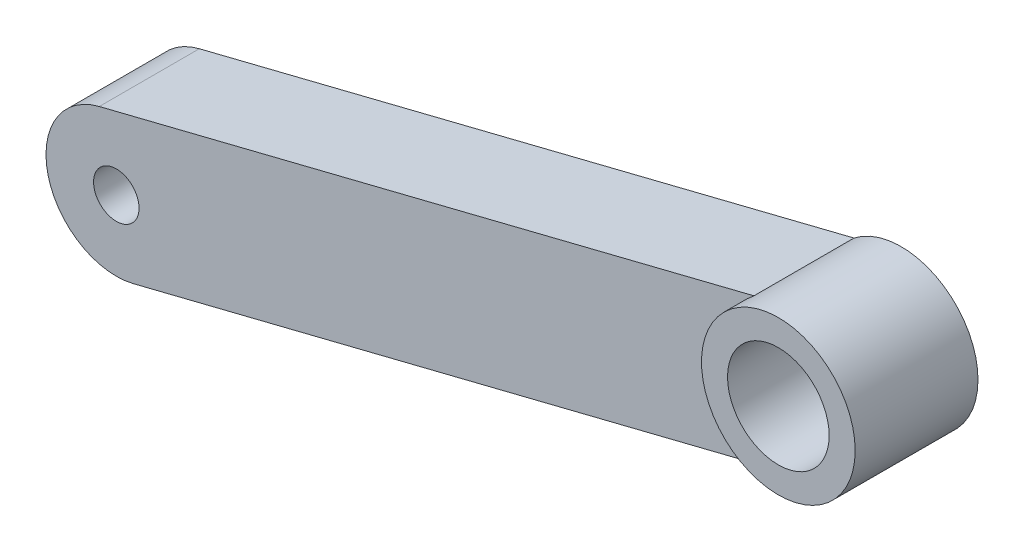
ISO-10303-21;
HEADER;
FILE_DESCRIPTION(('STEP AP214'),'2;1');
FILE_NAME('part.step','',(''),(''),'','','');
FILE_SCHEMA(('AUTOMOTIVE_DESIGN { 1 0 10303 214 1 1 1 1 }'));
ENDSEC;
DATA;
#1=APPLICATION_CONTEXT('core data for automotive mechanical design processes');
#2=APPLICATION_PROTOCOL_DEFINITION('international standard','automotive_design',2000,#1);
#3=PRODUCT_CONTEXT('',#1,'mechanical');
#4=PRODUCT('Part','Part','',(#3));
#5=PRODUCT_RELATED_PRODUCT_CATEGORY('part','',(#4));
#6=PRODUCT_DEFINITION_FORMATION('','',#4);
#7=PRODUCT_DEFINITION_CONTEXT('part definition',#1,'design');
#8=PRODUCT_DEFINITION('design','',#6,#7);
#9=PRODUCT_DEFINITION_SHAPE('','',#8);
#10=(LENGTH_UNIT() NAMED_UNIT(*) SI_UNIT(.MILLI.,.METRE.));
#11=(NAMED_UNIT(*) PLANE_ANGLE_UNIT() SI_UNIT($,.RADIAN.));
#12=(NAMED_UNIT(*) SI_UNIT($,.STERADIAN.) SOLID_ANGLE_UNIT());
#13=UNCERTAINTY_MEASURE_WITH_UNIT(LENGTH_MEASURE(1.E-05),#10,'distance_accuracy_value','');
#14=(GEOMETRIC_REPRESENTATION_CONTEXT(3) GLOBAL_UNCERTAINTY_ASSIGNED_CONTEXT((#13)) GLOBAL_UNIT_ASSIGNED_CONTEXT((#10,
#11,#12)) REPRESENTATION_CONTEXT('',''));
#15=CARTESIAN_POINT('',(0.,0.,0.));
#16=DIRECTION('',(0.,0.,1.));
#17=DIRECTION('',(1.,0.,0.));
#18=AXIS2_PLACEMENT_3D('',#15,#16,#17);
#19=CARTESIAN_POINT('',(-7.61999999999999,-54.61,12.446));
#20=DIRECTION('',(0.,0.,-1.));
#21=DIRECTION('',(-1.,0.,0.));
#22=AXIS2_PLACEMENT_3D('',#19,#20,#21);
#23=CYLINDRICAL_SURFACE('',#22,6.43616817790644);
#24=CARTESIAN_POINT('',(-7.61999999999999,-54.61,12.446));
#25=DIRECTION('',(0.,0.,1.));
#26=DIRECTION('',(1.,0.,0.));
#27=AXIS2_PLACEMENT_3D('',#24,#25,#26);
#28=CIRCLE('',#27,6.43616817790644);
#29=CARTESIAN_POINT('',(-1.18383182209355,-54.61,12.446));
#30=VERTEX_POINT('',#29);
#31=EDGE_CURVE('E116',#30,#30,#28,.T.);
#32=ORIENTED_EDGE('',*,*,#31,.F.);
#33=EDGE_LOOP('',(#32));
#34=FACE_BOUND('',#33,.T.);
#35=CARTESIAN_POINT('',(-7.61999999999999,-54.61,2.159));
#36=DIRECTION('',(0.,0.,-1.));
#37=DIRECTION('',(-1.,0.,0.));
#38=AXIS2_PLACEMENT_3D('',#35,#36,#37);
#39=CIRCLE('',#38,6.43616817790644);
#40=CARTESIAN_POINT('',(-11.5675266159483,-49.5265666690045,2.159));
#41=VERTEX_POINT('',#40);
#42=CARTESIAN_POINT('',(-8.71587852779336,-60.9521850388188,2.159));
#43=VERTEX_POINT('',#42);
#44=EDGE_CURVE('E74',#41,#43,#39,.T.);
#45=ORIENTED_EDGE('',*,*,#44,.F.);
#46=DIRECTION('',(0.,0.,-1.));
#47=VECTOR('',#46,1.);
#48=CARTESIAN_POINT('',(-11.5675266159483,-49.5265666690046,12.446));
#49=LINE('',#48,#47);
#50=CARTESIAN_POINT('',(-11.5675266159483,-49.5265666690045,10.541));
#51=VERTEX_POINT('',#50);
#52=EDGE_CURVE('E76',#41,#51,#49,.F.);
#53=ORIENTED_EDGE('',*,*,#52,.T.);
#54=CARTESIAN_POINT('',(-7.61999999999999,-54.61,10.541));
#55=DIRECTION('',(0.,0.,1.));
#56=DIRECTION('',(1.,0.,0.));
#57=AXIS2_PLACEMENT_3D('',#54,#55,#56);
#58=CIRCLE('',#57,6.43616817790644);
#59=CARTESIAN_POINT('',(-8.71587852779336,-60.9521850388188,10.541));
#60=VERTEX_POINT('',#59);
#61=EDGE_CURVE('E49',#60,#51,#58,.F.);
#62=ORIENTED_EDGE('',*,*,#61,.F.);
#63=DIRECTION('',(0.,0.,-1.));
#64=VECTOR('',#63,1.);
#65=CARTESIAN_POINT('',(-8.71587852779336,-60.9521850388188,12.446));
#66=LINE('',#65,#64);
#67=EDGE_CURVE('E11',#60,#43,#66,.T.);
#68=ORIENTED_EDGE('',*,*,#67,.T.);
#69=EDGE_LOOP('',(#45,#53,#62,#68));
#70=FACE_BOUND('',#69,.T.);
#71=ADVANCED_FACE('F33',(#34,#70),#23,.T.);
#72=CARTESIAN_POINT('',(-7.61999999999999,-54.61,10.541));
#73=DIRECTION('',(0.,0.,-1.));
#74=DIRECTION('',(-1.,0.,0.));
#75=AXIS2_PLACEMENT_3D('',#72,#73,#74);
#76=CYLINDRICAL_SURFACE('',#75,4.2545);
#77=CARTESIAN_POINT('',(-7.61999999999999,-54.61,12.446));
#78=DIRECTION('',(0.,0.,1.));
#79=DIRECTION('',(1.,0.,0.));
#80=AXIS2_PLACEMENT_3D('',#77,#78,#79);
#81=CIRCLE('',#80,4.2545);
#82=CARTESIAN_POINT('',(-3.36549999999999,-54.61,12.446));
#83=VERTEX_POINT('',#82);
#84=EDGE_CURVE('E119',#83,#83,#81,.T.);
#85=ORIENTED_EDGE('',*,*,#84,.T.);
#86=EDGE_LOOP('',(#85));
#87=FACE_BOUND('',#86,.T.);
#88=CARTESIAN_POINT('',(-7.61999999999999,-54.61,2.159));
#89=DIRECTION('',(0.,0.,-1.));
#90=DIRECTION('',(-1.,0.,0.));
#91=AXIS2_PLACEMENT_3D('',#88,#89,#90);
#92=CIRCLE('',#91,4.2545);
#93=CARTESIAN_POINT('',(-11.8745,-54.61,2.159));
#94=VERTEX_POINT('',#93);
#95=EDGE_CURVE('E37',#94,#94,#92,.T.);
#96=ORIENTED_EDGE('',*,*,#95,.T.);
#97=EDGE_LOOP('',(#96));
#98=FACE_BOUND('',#97,.T.);
#99=ADVANCED_FACE('F126',(#87,#98),#76,.F.);
#100=CARTESIAN_POINT('',(-7.61999999999999,-54.61,10.541));
#101=DIRECTION('',(0.,0.,1.));
#102=DIRECTION('',(1.,0.,0.));
#103=AXIS2_PLACEMENT_3D('',#100,#101,#102);
#104=PLANE('',#103);
#105=CARTESIAN_POINT('',(-64.977086836929,-68.9253938567371,10.541));
#106=DIRECTION('',(0.,0.,1.));
#107=DIRECTION('',(1.,0.,0.));
#108=AXIS2_PLACEMENT_3D('',#105,#106,#107);
#109=CIRCLE('',#108,1.90500000000001);
#110=CARTESIAN_POINT('',(-63.072086836929,-68.9253938567371,10.541));
#111=VERTEX_POINT('',#110);
#112=EDGE_CURVE('E92',#111,#111,#109,.T.);
#113=ORIENTED_EDGE('',*,*,#112,.F.);
#114=EDGE_LOOP('',(#113));
#115=FACE_BOUND('',#114,.T.);
#116=DIRECTION('',(0.97023746366398,0.242155454414902,0.));
#117=VECTOR('',#116,1.);
#118=CARTESIAN_POINT('',(-6.19417595592256,-60.3228091849071,10.541));
#119=LINE('',#118,#117);
#120=CARTESIAN_POINT('',(-63.5512627928516,-74.6382030416443,10.541));
#121=VERTEX_POINT('',#120);
#122=EDGE_CURVE('E99',#121,#60,#119,.T.);
#123=ORIENTED_EDGE('',*,*,#122,.T.);
#124=ORIENTED_EDGE('',*,*,#61,.T.);
#125=DIRECTION('',(-0.97023746366398,-0.242155454414902,0.));
#126=VECTOR('',#125,1.);
#127=CARTESIAN_POINT('',(-9.04582404407743,-48.8971908150929,10.541));
#128=LINE('',#127,#126);
#129=CARTESIAN_POINT('',(-66.4029108810065,-63.21258467183,10.541));
#130=VERTEX_POINT('',#129);
#131=EDGE_CURVE('E85',#51,#130,#128,.T.);
#132=ORIENTED_EDGE('',*,*,#131,.T.);
#133=CARTESIAN_POINT('',(-64.977086836929,-68.9253938567371,10.541));
#134=DIRECTION('',(0.,0.,1.));
#135=DIRECTION('',(1.,0.,0.));
#136=AXIS2_PLACEMENT_3D('',#133,#134,#135);
#137=CIRCLE('',#136,5.88805256326985);
#138=EDGE_CURVE('E110',#130,#121,#137,.T.);
#139=ORIENTED_EDGE('',*,*,#138,.T.);
#140=EDGE_LOOP('',(#123,#124,#132,#139));
#141=FACE_BOUND('',#140,.T.);
#142=ADVANCED_FACE('F128',(#115,#141),#104,.T.);
#143=CARTESIAN_POINT('',(-7.61999999999999,-54.61,2.159));
#144=DIRECTION('',(0.,0.,1.));
#145=DIRECTION('',(1.,0.,0.));
#146=AXIS2_PLACEMENT_3D('',#143,#144,#145);
#147=PLANE('',#146);
#148=CARTESIAN_POINT('',(-64.977086836929,-68.9253938567371,2.159));
#149=DIRECTION('',(0.,0.,1.));
#150=DIRECTION('',(1.,0.,0.));
#151=AXIS2_PLACEMENT_3D('',#148,#149,#150);
#152=CIRCLE('',#151,1.90500000000001);
#153=CARTESIAN_POINT('',(-63.072086836929,-68.9253938567371,2.159));
#154=VERTEX_POINT('',#153);
#155=EDGE_CURVE('E86',#154,#154,#152,.T.);
#156=ORIENTED_EDGE('',*,*,#155,.T.);
#157=EDGE_LOOP('',(#156));
#158=FACE_BOUND('',#157,.T.);
#159=DIRECTION('',(-0.97023746366398,-0.242155454414902,0.));
#160=VECTOR('',#159,1.);
#161=CARTESIAN_POINT('',(-9.04582404407743,-48.8971908150929,2.159));
#162=LINE('',#161,#160);
#163=CARTESIAN_POINT('',(-66.4029108810065,-63.21258467183,2.159));
#164=VERTEX_POINT('',#163);
#165=EDGE_CURVE('E83',#41,#164,#162,.T.);
#166=ORIENTED_EDGE('',*,*,#165,.F.);
#167=ORIENTED_EDGE('',*,*,#44,.T.);
#168=DIRECTION('',(0.97023746366398,0.242155454414902,0.));
#169=VECTOR('',#168,1.);
#170=CARTESIAN_POINT('',(-6.19417595592256,-60.3228091849071,2.159));
#171=LINE('',#170,#169);
#172=CARTESIAN_POINT('',(-63.5512627928516,-74.6382030416443,2.159));
#173=VERTEX_POINT('',#172);
#174=EDGE_CURVE('E94',#173,#43,#171,.T.);
#175=ORIENTED_EDGE('',*,*,#174,.F.);
#176=CARTESIAN_POINT('',(-64.977086836929,-68.9253938567371,2.159));
#177=DIRECTION('',(0.,0.,1.));
#178=DIRECTION('',(1.,0.,0.));
#179=AXIS2_PLACEMENT_3D('',#176,#177,#178);
#180=CIRCLE('',#179,5.88805256326985);
#181=EDGE_CURVE('E91',#164,#173,#180,.T.);
#182=ORIENTED_EDGE('',*,*,#181,.F.);
#183=EDGE_LOOP('',(#166,#167,#175,#182));
#184=FACE_BOUND('',#183,.T.);
#185=ORIENTED_EDGE('',*,*,#95,.F.);
#186=EDGE_LOOP('',(#185));
#187=FACE_BOUND('',#186,.T.);
#188=ADVANCED_FACE('F89',(#158,#184,#187),#147,.F.);
#189=CARTESIAN_POINT('',(-9.04582404407743,-48.8971908150929,10.541));
#190=DIRECTION('',(0.242155454414902,-0.97023746366398,0.));
#191=DIRECTION('',(0.97023746366398,0.242155454414902,0.));
#192=AXIS2_PLACEMENT_3D('',#189,#190,#191);
#193=PLANE('',#192);
#194=ORIENTED_EDGE('',*,*,#52,.F.);
#195=ORIENTED_EDGE('',*,*,#165,.T.);
#196=DIRECTION('',(0.,0.,-1.));
#197=VECTOR('',#196,1.);
#198=CARTESIAN_POINT('',(-66.4029108810065,-63.21258467183,10.541));
#199=LINE('',#198,#197);
#200=EDGE_CURVE('E42',#130,#164,#199,.T.);
#201=ORIENTED_EDGE('',*,*,#200,.F.);
#202=ORIENTED_EDGE('',*,*,#131,.F.);
#203=EDGE_LOOP('',(#194,#195,#201,#202));
#204=FACE_BOUND('',#203,.T.);
#205=ADVANCED_FACE('F35',(#204),#193,.F.);
#206=CARTESIAN_POINT('',(-6.19417595592256,-60.3228091849071,10.541));
#207=DIRECTION('',(-0.242155454414902,0.97023746366398,0.));
#208=DIRECTION('',(-0.97023746366398,-0.242155454414902,0.));
#209=AXIS2_PLACEMENT_3D('',#206,#207,#208);
#210=PLANE('',#209);
#211=ORIENTED_EDGE('',*,*,#67,.F.);
#212=ORIENTED_EDGE('',*,*,#122,.F.);
#213=DIRECTION('',(0.,0.,-1.));
#214=VECTOR('',#213,1.);
#215=CARTESIAN_POINT('',(-63.5512627928516,-74.6382030416443,10.541));
#216=LINE('',#215,#214);
#217=EDGE_CURVE('E103',#121,#173,#216,.T.);
#218=ORIENTED_EDGE('',*,*,#217,.T.);
#219=ORIENTED_EDGE('',*,*,#174,.T.);
#220=EDGE_LOOP('',(#211,#212,#218,#219));
#221=FACE_BOUND('',#220,.T.);
#222=ADVANCED_FACE('F135',(#221),#210,.F.);
#223=CARTESIAN_POINT('',(-64.977086836929,-68.9253938567371,10.541));
#224=DIRECTION('',(0.,0.,-1.));
#225=DIRECTION('',(-1.,0.,0.));
#226=AXIS2_PLACEMENT_3D('',#223,#224,#225);
#227=CYLINDRICAL_SURFACE('',#226,5.88805256326985);
#228=ORIENTED_EDGE('',*,*,#181,.T.);
#229=ORIENTED_EDGE('',*,*,#217,.F.);
#230=ORIENTED_EDGE('',*,*,#138,.F.);
#231=ORIENTED_EDGE('',*,*,#200,.T.);
#232=EDGE_LOOP('',(#228,#229,#230,#231));
#233=FACE_BOUND('',#232,.T.);
#234=ADVANCED_FACE('F108',(#233),#227,.T.);
#235=CARTESIAN_POINT('',(-64.977086836929,-68.9253938567371,10.541));
#236=DIRECTION('',(0.,0.,-1.));
#237=DIRECTION('',(-1.,0.,0.));
#238=AXIS2_PLACEMENT_3D('',#235,#236,#237);
#239=CYLINDRICAL_SURFACE('',#238,1.90500000000001);
#240=ORIENTED_EDGE('',*,*,#112,.T.);
#241=EDGE_LOOP('',(#240));
#242=FACE_BOUND('',#241,.T.);
#243=ORIENTED_EDGE('',*,*,#155,.F.);
#244=EDGE_LOOP('',(#243));
#245=FACE_BOUND('',#244,.T.);
#246=ADVANCED_FACE('F150',(#242,#245),#239,.F.);
#247=CARTESIAN_POINT('',(-7.61999999999999,-54.61,12.446));
#248=DIRECTION('',(0.,0.,1.));
#249=DIRECTION('',(1.,0.,0.));
#250=AXIS2_PLACEMENT_3D('',#247,#248,#249);
#251=PLANE('',#250);
#252=ORIENTED_EDGE('',*,*,#31,.T.);
#253=EDGE_LOOP('',(#252));
#254=FACE_BOUND('',#253,.T.);
#255=ORIENTED_EDGE('',*,*,#84,.F.);
#256=EDGE_LOOP('',(#255));
#257=FACE_BOUND('',#256,.T.);
#258=ADVANCED_FACE('F149',(#254,#257),#251,.T.);
#259=CLOSED_SHELL('',(#71,#99,#142,#188,#205,#222,#234,#246,#258));
#260=MANIFOLD_SOLID_BREP('B2',#259);
#261=ADVANCED_BREP_SHAPE_REPRESENTATION('',(#18,#260),#14);
#262=SHAPE_DEFINITION_REPRESENTATION(#9,#261);
ENDSEC;
END-ISO-10303-21;
